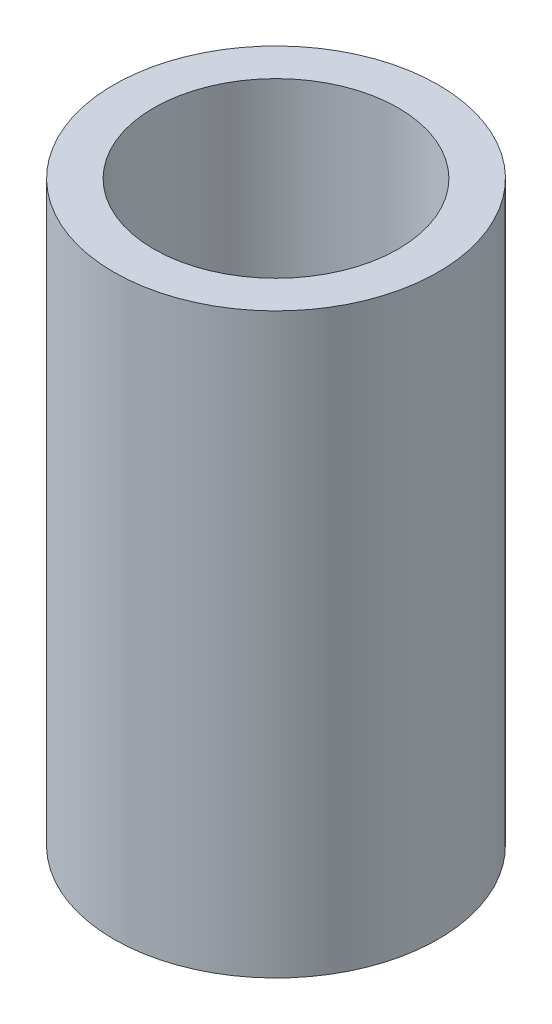
ISO-10303-21;
HEADER;
FILE_DESCRIPTION(('STEP AP214'),'2;1');
FILE_NAME('part.step','',(''),(''),'','','');
FILE_SCHEMA(('AUTOMOTIVE_DESIGN { 1 0 10303 214 1 1 1 1 }'));
ENDSEC;
DATA;
#1=APPLICATION_CONTEXT('core data for automotive mechanical design processes');
#2=APPLICATION_PROTOCOL_DEFINITION('international standard','automotive_design',2000,#1);
#3=PRODUCT_CONTEXT('',#1,'mechanical');
#4=PRODUCT('Part','Part','',(#3));
#5=PRODUCT_RELATED_PRODUCT_CATEGORY('part','',(#4));
#6=PRODUCT_DEFINITION_FORMATION('','',#4);
#7=PRODUCT_DEFINITION_CONTEXT('part definition',#1,'design');
#8=PRODUCT_DEFINITION('design','',#6,#7);
#9=PRODUCT_DEFINITION_SHAPE('','',#8);
#10=(LENGTH_UNIT() NAMED_UNIT(*) SI_UNIT(.MILLI.,.METRE.));
#11=(NAMED_UNIT(*) PLANE_ANGLE_UNIT() SI_UNIT($,.RADIAN.));
#12=(NAMED_UNIT(*) SI_UNIT($,.STERADIAN.) SOLID_ANGLE_UNIT());
#13=UNCERTAINTY_MEASURE_WITH_UNIT(LENGTH_MEASURE(1.E-05),#10,'distance_accuracy_value','');
#14=(GEOMETRIC_REPRESENTATION_CONTEXT(3) GLOBAL_UNCERTAINTY_ASSIGNED_CONTEXT((#13)) GLOBAL_UNIT_ASSIGNED_CONTEXT((#10,
#11,#12)) REPRESENTATION_CONTEXT('',''));
#15=CARTESIAN_POINT('',(0.,0.,0.));
#16=DIRECTION('',(0.,0.,1.));
#17=DIRECTION('',(1.,0.,0.));
#18=AXIS2_PLACEMENT_3D('',#15,#16,#17);
#19=CARTESIAN_POINT('',(0.,60.,0.));
#20=DIRECTION('',(0.,1.,0.));
#21=DIRECTION('',(0.,0.,1.));
#22=AXIS2_PLACEMENT_3D('',#19,#20,#21);
#23=PLANE('',#22);
#24=CARTESIAN_POINT('',(0.,60.,0.));
#25=DIRECTION('',(0.,1.,0.));
#26=DIRECTION('',(0.,0.,1.));
#27=AXIS2_PLACEMENT_3D('',#24,#25,#26);
#28=CIRCLE('',#27,16.85);
#29=CARTESIAN_POINT('',(0.,60.,16.85));
#30=VERTEX_POINT('',#29);
#31=EDGE_CURVE('E10',#30,#30,#28,.T.);
#32=ORIENTED_EDGE('',*,*,#31,.T.);
#33=EDGE_LOOP('',(#32));
#34=FACE_BOUND('',#33,.T.);
#35=CARTESIAN_POINT('',(0.,60.,0.));
#36=DIRECTION('',(0.,1.,0.));
#37=DIRECTION('',(0.,0.,1.));
#38=AXIS2_PLACEMENT_3D('',#35,#36,#37);
#39=CIRCLE('',#38,12.7);
#40=CARTESIAN_POINT('',(0.,60.,12.7));
#41=VERTEX_POINT('',#40);
#42=EDGE_CURVE('E48',#41,#41,#39,.T.);
#43=ORIENTED_EDGE('',*,*,#42,.F.);
#44=EDGE_LOOP('',(#43));
#45=FACE_BOUND('',#44,.T.);
#46=ADVANCED_FACE('F37',(#34,#45),#23,.T.);
#47=CARTESIAN_POINT('',(0.,0.,0.));
#48=DIRECTION('',(0.,1.,0.));
#49=DIRECTION('',(0.,0.,1.));
#50=AXIS2_PLACEMENT_3D('',#47,#48,#49);
#51=PLANE('',#50);
#52=CARTESIAN_POINT('',(0.,0.,0.));
#53=DIRECTION('',(0.,1.,0.));
#54=DIRECTION('',(0.,0.,1.));
#55=AXIS2_PLACEMENT_3D('',#52,#53,#54);
#56=CIRCLE('',#55,16.85);
#57=CARTESIAN_POINT('',(0.,0.,16.85));
#58=VERTEX_POINT('',#57);
#59=EDGE_CURVE('E41',#58,#58,#56,.T.);
#60=ORIENTED_EDGE('',*,*,#59,.F.);
#61=EDGE_LOOP('',(#60));
#62=FACE_BOUND('',#61,.T.);
#63=CARTESIAN_POINT('',(0.,0.,0.));
#64=DIRECTION('',(0.,1.,0.));
#65=DIRECTION('',(0.,0.,1.));
#66=AXIS2_PLACEMENT_3D('',#63,#64,#65);
#67=CIRCLE('',#66,12.7);
#68=CARTESIAN_POINT('',(0.,0.,12.7));
#69=VERTEX_POINT('',#68);
#70=EDGE_CURVE('E50',#69,#69,#67,.T.);
#71=ORIENTED_EDGE('',*,*,#70,.T.);
#72=EDGE_LOOP('',(#71));
#73=FACE_BOUND('',#72,.T.);
#74=ADVANCED_FACE('F60',(#62,#73),#51,.F.);
#75=CARTESIAN_POINT('',(0.,60.,0.));
#76=DIRECTION('',(0.,-1.,0.));
#77=DIRECTION('',(0.,0.,-1.));
#78=AXIS2_PLACEMENT_3D('',#75,#76,#77);
#79=CYLINDRICAL_SURFACE('',#78,16.85);
#80=ORIENTED_EDGE('',*,*,#31,.F.);
#81=EDGE_LOOP('',(#80));
#82=FACE_BOUND('',#81,.T.);
#83=ORIENTED_EDGE('',*,*,#59,.T.);
#84=EDGE_LOOP('',(#83));
#85=FACE_BOUND('',#84,.T.);
#86=ADVANCED_FACE('F39',(#82,#85),#79,.T.);
#87=CARTESIAN_POINT('',(0.,60.,0.));
#88=DIRECTION('',(0.,-1.,0.));
#89=DIRECTION('',(0.,0.,-1.));
#90=AXIS2_PLACEMENT_3D('',#87,#88,#89);
#91=CYLINDRICAL_SURFACE('',#90,12.7);
#92=ORIENTED_EDGE('',*,*,#42,.T.);
#93=EDGE_LOOP('',(#92));
#94=FACE_BOUND('',#93,.T.);
#95=ORIENTED_EDGE('',*,*,#70,.F.);
#96=EDGE_LOOP('',(#95));
#97=FACE_BOUND('',#96,.T.);
#98=ADVANCED_FACE('F56',(#94,#97),#91,.F.);
#99=CLOSED_SHELL('',(#46,#74,#86,#98));
#100=MANIFOLD_SOLID_BREP('B2',#99);
#101=ADVANCED_BREP_SHAPE_REPRESENTATION('',(#18,#100),#14);
#102=SHAPE_DEFINITION_REPRESENTATION(#9,#101);
ENDSEC;
END-ISO-10303-21;
